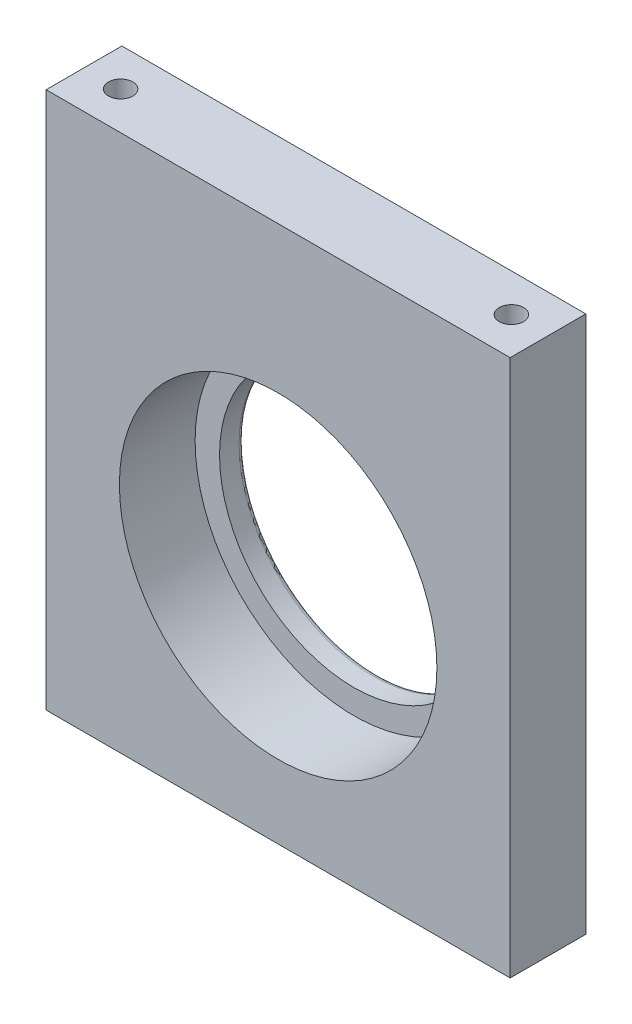
ISO-10303-21;
HEADER;
FILE_DESCRIPTION(('STEP AP214'),'2;1');
FILE_NAME('part.step','',(''),(''),'','','');
FILE_SCHEMA(('AUTOMOTIVE_DESIGN { 1 0 10303 214 1 1 1 1 }'));
ENDSEC;
DATA;
#1=APPLICATION_CONTEXT('core data for automotive mechanical design processes');
#2=APPLICATION_PROTOCOL_DEFINITION('international standard','automotive_design',2000,#1);
#3=PRODUCT_CONTEXT('',#1,'mechanical');
#4=PRODUCT('Part','Part','',(#3));
#5=PRODUCT_RELATED_PRODUCT_CATEGORY('part','',(#4));
#6=PRODUCT_DEFINITION_FORMATION('','',#4);
#7=PRODUCT_DEFINITION_CONTEXT('part definition',#1,'design');
#8=PRODUCT_DEFINITION('design','',#6,#7);
#9=PRODUCT_DEFINITION_SHAPE('','',#8);
#10=(LENGTH_UNIT() NAMED_UNIT(*) SI_UNIT(.MILLI.,.METRE.));
#11=(NAMED_UNIT(*) PLANE_ANGLE_UNIT() SI_UNIT($,.RADIAN.));
#12=(NAMED_UNIT(*) SI_UNIT($,.STERADIAN.) SOLID_ANGLE_UNIT());
#13=UNCERTAINTY_MEASURE_WITH_UNIT(LENGTH_MEASURE(1.E-05),#10,'distance_accuracy_value','');
#14=(GEOMETRIC_REPRESENTATION_CONTEXT(3) GLOBAL_UNCERTAINTY_ASSIGNED_CONTEXT((#13)) GLOBAL_UNIT_ASSIGNED_CONTEXT((#10,
#11,#12)) REPRESENTATION_CONTEXT('',''));
#15=CARTESIAN_POINT('',(0.,0.,0.));
#16=DIRECTION('',(0.,0.,1.));
#17=DIRECTION('',(1.,0.,0.));
#18=AXIS2_PLACEMENT_3D('',#15,#16,#17);
#19=CARTESIAN_POINT('',(0.,0.,-31.));
#20=DIRECTION('',(0.,0.,1.));
#21=DIRECTION('',(1.,0.,0.));
#22=AXIS2_PLACEMENT_3D('',#19,#20,#21);
#23=PLANE('',#22);
#24=DIRECTION('',(1.,0.,0.));
#25=VECTOR('',#24,1.);
#26=CARTESIAN_POINT('',(-75.,172.,-31.));
#27=LINE('',#26,#25);
#28=CARTESIAN_POINT('',(77.,172.,-31.));
#29=VERTEX_POINT('',#28);
#30=CARTESIAN_POINT('',(-77.,172.,-31.));
#31=VERTEX_POINT('',#30);
#32=EDGE_CURVE('E191',#29,#31,#27,.F.);
#33=ORIENTED_EDGE('',*,*,#32,.T.);
#34=DIRECTION('',(0.,1.,0.));
#35=VECTOR('',#34,1.);
#36=CARTESIAN_POINT('',(-77.,20.,-31.));
#37=LINE('',#36,#35);
#38=CARTESIAN_POINT('',(-77.,18.,-31.));
#39=VERTEX_POINT('',#38);
#40=EDGE_CURVE('E197',#31,#39,#37,.F.);
#41=ORIENTED_EDGE('',*,*,#40,.T.);
#42=DIRECTION('',(-1.,0.,0.));
#43=VECTOR('',#42,1.);
#44=CARTESIAN_POINT('',(75.,18.,-31.));
#45=LINE('',#44,#43);
#46=CARTESIAN_POINT('',(77.,18.,-31.));
#47=VERTEX_POINT('',#46);
#48=EDGE_CURVE('E195',#39,#47,#45,.F.);
#49=ORIENTED_EDGE('',*,*,#48,.T.);
#50=DIRECTION('',(0.,-1.,0.));
#51=VECTOR('',#50,1.);
#52=CARTESIAN_POINT('',(77.,170.,-31.));
#53=LINE('',#52,#51);
#54=EDGE_CURVE('E193',#47,#29,#53,.F.);
#55=ORIENTED_EDGE('',*,*,#54,.T.);
#56=EDGE_LOOP('',(#33,#41,#49,#55));
#57=FACE_BOUND('',#56,.T.);
#58=DIRECTION('',(0.,1.,0.));
#59=VECTOR('',#58,1.);
#60=CARTESIAN_POINT('',(95.,0.,-31.));
#61=LINE('',#60,#59);
#62=CARTESIAN_POINT('',(95.,0.,-31.));
#63=VERTEX_POINT('',#62);
#64=CARTESIAN_POINT('',(95.,220.,-31.));
#65=VERTEX_POINT('',#64);
#66=EDGE_CURVE('E159',#63,#65,#61,.T.);
#67=ORIENTED_EDGE('',*,*,#66,.F.);
#68=DIRECTION('',(1.,0.,0.));
#69=VECTOR('',#68,1.);
#70=CARTESIAN_POINT('',(-95.,0.,-31.));
#71=LINE('',#70,#69);
#72=CARTESIAN_POINT('',(-95.,0.,-31.));
#73=VERTEX_POINT('',#72);
#74=EDGE_CURVE('E169',#73,#63,#71,.T.);
#75=ORIENTED_EDGE('',*,*,#74,.F.);
#76=DIRECTION('',(0.,-1.,0.));
#77=VECTOR('',#76,1.);
#78=CARTESIAN_POINT('',(-95.,220.,-31.));
#79=LINE('',#78,#77);
#80=CARTESIAN_POINT('',(-95.,220.,-31.));
#81=VERTEX_POINT('',#80);
#82=EDGE_CURVE('E166',#81,#73,#79,.T.);
#83=ORIENTED_EDGE('',*,*,#82,.F.);
#84=DIRECTION('',(-1.,0.,0.));
#85=VECTOR('',#84,1.);
#86=CARTESIAN_POINT('',(95.,220.,-31.));
#87=LINE('',#86,#85);
#88=EDGE_CURVE('E162',#65,#81,#87,.T.);
#89=ORIENTED_EDGE('',*,*,#88,.F.);
#90=EDGE_LOOP('',(#67,#75,#83,#89));
#91=FACE_BOUND('',#90,.T.);
#92=ADVANCED_FACE('F34',(#57,#91),#23,.F.);
#93=CARTESIAN_POINT('',(95.,0.,-31.));
#94=DIRECTION('',(1.,0.,0.));
#95=DIRECTION('',(0.,1.,0.));
#96=AXIS2_PLACEMENT_3D('',#93,#94,#95);
#97=PLANE('',#96);
#98=DIRECTION('',(0.,1.,0.));
#99=VECTOR('',#98,1.);
#100=CARTESIAN_POINT('',(95.,0.,0.));
#101=LINE('',#100,#99);
#102=CARTESIAN_POINT('',(95.,0.,0.));
#103=VERTEX_POINT('',#102);
#104=CARTESIAN_POINT('',(95.,220.,0.));
#105=VERTEX_POINT('',#104);
#106=EDGE_CURVE('E158',#103,#105,#101,.T.);
#107=ORIENTED_EDGE('',*,*,#106,.F.);
#108=DIRECTION('',(0.,0.,1.));
#109=VECTOR('',#108,1.);
#110=CARTESIAN_POINT('',(95.,0.,-31.));
#111=LINE('',#110,#109);
#112=EDGE_CURVE('E183',#63,#103,#111,.T.);
#113=ORIENTED_EDGE('',*,*,#112,.F.);
#114=ORIENTED_EDGE('',*,*,#66,.T.);
#115=DIRECTION('',(0.,0.,1.));
#116=VECTOR('',#115,1.);
#117=CARTESIAN_POINT('',(95.,220.,-31.));
#118=LINE('',#117,#116);
#119=EDGE_CURVE('E172',#65,#105,#118,.T.);
#120=ORIENTED_EDGE('',*,*,#119,.T.);
#121=EDGE_LOOP('',(#107,#113,#114,#120));
#122=FACE_BOUND('',#121,.T.);
#123=ADVANCED_FACE('F230',(#122),#97,.T.);
#124=CARTESIAN_POINT('',(-95.,0.,-31.));
#125=DIRECTION('',(0.,-1.,0.));
#126=DIRECTION('',(0.,0.,-1.));
#127=AXIS2_PLACEMENT_3D('',#124,#125,#126);
#128=PLANE('',#127);
#129=DIRECTION('',(1.,0.,0.));
#130=VECTOR('',#129,1.);
#131=CARTESIAN_POINT('',(-95.,0.,0.));
#132=LINE('',#131,#130);
#133=CARTESIAN_POINT('',(-95.,0.,0.));
#134=VERTEX_POINT('',#133);
#135=EDGE_CURVE('E163',#134,#103,#132,.T.);
#136=ORIENTED_EDGE('',*,*,#135,.F.);
#137=DIRECTION('',(0.,0.,1.));
#138=VECTOR('',#137,1.);
#139=CARTESIAN_POINT('',(-95.,0.,-31.));
#140=LINE('',#139,#138);
#141=EDGE_CURVE('E185',#73,#134,#140,.T.);
#142=ORIENTED_EDGE('',*,*,#141,.F.);
#143=ORIENTED_EDGE('',*,*,#74,.T.);
#144=ORIENTED_EDGE('',*,*,#112,.T.);
#145=EDGE_LOOP('',(#136,#142,#143,#144));
#146=FACE_BOUND('',#145,.T.);
#147=ADVANCED_FACE('F238',(#146),#128,.T.);
#148=CARTESIAN_POINT('',(-95.,220.,-31.));
#149=DIRECTION('',(-1.,0.,0.));
#150=DIRECTION('',(0.,-1.,0.));
#151=AXIS2_PLACEMENT_3D('',#148,#149,#150);
#152=PLANE('',#151);
#153=DIRECTION('',(0.,-1.,0.));
#154=VECTOR('',#153,1.);
#155=CARTESIAN_POINT('',(-95.,220.,0.));
#156=LINE('',#155,#154);
#157=CARTESIAN_POINT('',(-95.,220.,0.));
#158=VERTEX_POINT('',#157);
#159=EDGE_CURVE('E178',#158,#134,#156,.T.);
#160=ORIENTED_EDGE('',*,*,#159,.F.);
#161=DIRECTION('',(0.,0.,1.));
#162=VECTOR('',#161,1.);
#163=CARTESIAN_POINT('',(-95.,220.,-31.));
#164=LINE('',#163,#162);
#165=EDGE_CURVE('E187',#81,#158,#164,.T.);
#166=ORIENTED_EDGE('',*,*,#165,.F.);
#167=ORIENTED_EDGE('',*,*,#82,.T.);
#168=ORIENTED_EDGE('',*,*,#141,.T.);
#169=EDGE_LOOP('',(#160,#166,#167,#168));
#170=FACE_BOUND('',#169,.T.);
#171=ADVANCED_FACE('F253',(#170),#152,.T.);
#172=CARTESIAN_POINT('',(95.,220.,-31.));
#173=DIRECTION('',(0.,1.,0.));
#174=DIRECTION('',(0.,0.,1.));
#175=AXIS2_PLACEMENT_3D('',#172,#173,#174);
#176=PLANE('',#175);
#177=CARTESIAN_POINT('',(80.,220.,-15.5));
#178=DIRECTION('',(0.,-1.,0.));
#179=DIRECTION('',(0.,0.,1.));
#180=AXIS2_PLACEMENT_3D('',#177,#178,#179);
#181=CIRCLE('',#180,5.);
#182=CARTESIAN_POINT('',(80.,220.,-10.5));
#183=VERTEX_POINT('',#182);
#184=EDGE_CURVE('E135',#183,#183,#181,.T.);
#185=ORIENTED_EDGE('',*,*,#184,.T.);
#186=EDGE_LOOP('',(#185));
#187=FACE_BOUND('',#186,.T.);
#188=CARTESIAN_POINT('',(-80.,220.,-15.5));
#189=DIRECTION('',(0.,1.,0.));
#190=DIRECTION('',(0.,0.,1.));
#191=AXIS2_PLACEMENT_3D('',#188,#189,#190);
#192=CIRCLE('',#191,5.);
#193=CARTESIAN_POINT('',(-80.,220.,-10.5));
#194=VERTEX_POINT('',#193);
#195=EDGE_CURVE('E145',#194,#194,#192,.T.);
#196=ORIENTED_EDGE('',*,*,#195,.F.);
#197=EDGE_LOOP('',(#196));
#198=FACE_BOUND('',#197,.T.);
#199=DIRECTION('',(-1.,0.,0.));
#200=VECTOR('',#199,1.);
#201=CARTESIAN_POINT('',(95.,220.,0.));
#202=LINE('',#201,#200);
#203=EDGE_CURVE('E175',#105,#158,#202,.T.);
#204=ORIENTED_EDGE('',*,*,#203,.F.);
#205=ORIENTED_EDGE('',*,*,#119,.F.);
#206=ORIENTED_EDGE('',*,*,#88,.T.);
#207=ORIENTED_EDGE('',*,*,#165,.T.);
#208=EDGE_LOOP('',(#204,#205,#206,#207));
#209=FACE_BOUND('',#208,.T.);
#210=ADVANCED_FACE('F249',(#187,#198,#209),#176,.T.);
#211=CARTESIAN_POINT('',(0.,0.,0.));
#212=DIRECTION('',(0.,0.,1.));
#213=DIRECTION('',(1.,0.,0.));
#214=AXIS2_PLACEMENT_3D('',#211,#212,#213);
#215=PLANE('',#214);
#216=CARTESIAN_POINT('',(0.,95.,0.));
#217=DIRECTION('',(0.,0.,1.));
#218=DIRECTION('',(1.,0.,0.));
#219=AXIS2_PLACEMENT_3D('',#216,#217,#218);
#220=CIRCLE('',#219,65.);
#221=CARTESIAN_POINT('',(65.,95.,0.));
#222=VERTEX_POINT('',#221);
#223=EDGE_CURVE('E150',#222,#222,#220,.T.);
#224=ORIENTED_EDGE('',*,*,#223,.F.);
#225=EDGE_LOOP('',(#224));
#226=FACE_BOUND('',#225,.T.);
#227=ORIENTED_EDGE('',*,*,#106,.T.);
#228=ORIENTED_EDGE('',*,*,#203,.T.);
#229=ORIENTED_EDGE('',*,*,#159,.T.);
#230=ORIENTED_EDGE('',*,*,#135,.T.);
#231=EDGE_LOOP('',(#227,#228,#229,#230));
#232=FACE_BOUND('',#231,.T.);
#233=ADVANCED_FACE('F246',(#226,#232),#215,.T.);
#234=CARTESIAN_POINT('',(0.,95.,-38.));
#235=DIRECTION('',(0.,0.,1.));
#236=DIRECTION('',(1.,0.,0.));
#237=AXIS2_PLACEMENT_3D('',#234,#235,#236);
#238=CYLINDRICAL_SURFACE('',#237,65.);
#239=ORIENTED_EDGE('',*,*,#223,.T.);
#240=EDGE_LOOP('',(#239));
#241=FACE_BOUND('',#240,.T.);
#242=CARTESIAN_POINT('',(0.,95.,-31.));
#243=DIRECTION('',(0.,0.,1.));
#244=DIRECTION('',(1.,0.,0.));
#245=AXIS2_PLACEMENT_3D('',#242,#243,#244);
#246=CIRCLE('',#245,65.);
#247=CARTESIAN_POINT('',(65.,95.,-31.));
#248=VERTEX_POINT('',#247);
#249=EDGE_CURVE('E155',#248,#248,#246,.T.);
#250=ORIENTED_EDGE('',*,*,#249,.F.);
#251=EDGE_LOOP('',(#250));
#252=FACE_BOUND('',#251,.T.);
#253=ADVANCED_FACE('F244',(#241,#252),#238,.F.);
#254=CARTESIAN_POINT('',(-80.,190.,-15.5));
#255=DIRECTION('',(0.,1.,0.));
#256=DIRECTION('',(0.,0.,1.));
#257=AXIS2_PLACEMENT_3D('',#254,#255,#256);
#258=CYLINDRICAL_SURFACE('',#257,5.);
#259=CARTESIAN_POINT('',(-80.,190.,-15.5));
#260=DIRECTION('',(0.,1.,0.));
#261=DIRECTION('',(0.,0.,1.));
#262=AXIS2_PLACEMENT_3D('',#259,#260,#261);
#263=CIRCLE('',#262,5.);
#264=CARTESIAN_POINT('',(-80.,190.,-10.5));
#265=VERTEX_POINT('',#264);
#266=EDGE_CURVE('E147',#265,#265,#263,.T.);
#267=ORIENTED_EDGE('',*,*,#266,.F.);
#268=EDGE_LOOP('',(#267));
#269=FACE_BOUND('',#268,.T.);
#270=ORIENTED_EDGE('',*,*,#195,.T.);
#271=EDGE_LOOP('',(#270));
#272=FACE_BOUND('',#271,.T.);
#273=ADVANCED_FACE('F302',(#269,#272),#258,.F.);
#274=CARTESIAN_POINT('',(-80.,190.,-15.5));
#275=DIRECTION('',(0.,1.,0.));
#276=DIRECTION('',(0.,0.,1.));
#277=AXIS2_PLACEMENT_3D('',#274,#275,#276);
#278=PLANE('',#277);
#279=ORIENTED_EDGE('',*,*,#266,.T.);
#280=EDGE_LOOP('',(#279));
#281=FACE_BOUND('',#280,.T.);
#282=ADVANCED_FACE('F307',(#281),#278,.T.);
#283=CARTESIAN_POINT('',(80.,190.,-15.5));
#284=DIRECTION('',(0.,1.,0.));
#285=DIRECTION('',(0.,0.,1.));
#286=AXIS2_PLACEMENT_3D('',#283,#284,#285);
#287=CYLINDRICAL_SURFACE('',#286,5.);
#288=CARTESIAN_POINT('',(80.,190.,-15.5));
#289=DIRECTION('',(0.,-1.,0.));
#290=DIRECTION('',(0.,0.,1.));
#291=AXIS2_PLACEMENT_3D('',#288,#289,#290);
#292=CIRCLE('',#291,5.);
#293=CARTESIAN_POINT('',(80.,190.,-10.5));
#294=VERTEX_POINT('',#293);
#295=EDGE_CURVE('E138',#294,#294,#292,.T.);
#296=ORIENTED_EDGE('',*,*,#295,.T.);
#297=EDGE_LOOP('',(#296));
#298=FACE_BOUND('',#297,.T.);
#299=ORIENTED_EDGE('',*,*,#184,.F.);
#300=EDGE_LOOP('',(#299));
#301=FACE_BOUND('',#300,.T.);
#302=ADVANCED_FACE('F323',(#298,#301),#287,.F.);
#303=CARTESIAN_POINT('',(80.,190.,-15.5));
#304=DIRECTION('',(0.,1.,0.));
#305=DIRECTION('',(0.,0.,1.));
#306=AXIS2_PLACEMENT_3D('',#303,#304,#305);
#307=PLANE('',#306);
#308=ORIENTED_EDGE('',*,*,#295,.F.);
#309=EDGE_LOOP('',(#308));
#310=FACE_BOUND('',#309,.T.);
#311=ADVANCED_FACE('F297',(#310),#307,.T.);
#312=CARTESIAN_POINT('',(0.,0.,-31.));
#313=DIRECTION('',(0.,0.,1.));
#314=DIRECTION('',(1.,0.,0.));
#315=AXIS2_PLACEMENT_3D('',#312,#313,#314);
#316=PLANE('',#315);
#317=CARTESIAN_POINT('',(0.,95.,-31.));
#318=DIRECTION('',(0.,0.,-1.));
#319=DIRECTION('',(-1.,0.,0.));
#320=AXIS2_PLACEMENT_3D('',#317,#318,#319);
#321=CIRCLE('',#320,55.);
#322=CARTESIAN_POINT('',(-55.,95.,-31.));
#323=VERTEX_POINT('',#322);
#324=EDGE_CURVE('E129',#323,#323,#321,.T.);
#325=ORIENTED_EDGE('',*,*,#324,.T.);
#326=EDGE_LOOP('',(#325));
#327=FACE_BOUND('',#326,.T.);
#328=ORIENTED_EDGE('',*,*,#249,.T.);
#329=EDGE_LOOP('',(#328));
#330=FACE_BOUND('',#329,.T.);
#331=ADVANCED_FACE('F294',(#327,#330),#316,.T.);
#332=CARTESIAN_POINT('',(0.,0.,-41.));
#333=DIRECTION('',(0.,0.,1.));
#334=DIRECTION('',(1.,0.,0.));
#335=AXIS2_PLACEMENT_3D('',#332,#333,#334);
#336=PLANE('',#335);
#337=CARTESIAN_POINT('',(0.,95.,-41.));
#338=DIRECTION('',(0.,0.,1.));
#339=DIRECTION('',(1.,0.,0.));
#340=AXIS2_PLACEMENT_3D('',#337,#338,#339);
#341=CIRCLE('',#340,57.);
#342=CARTESIAN_POINT('',(57.,95.,-41.));
#343=VERTEX_POINT('',#342);
#344=EDGE_CURVE('E11',#343,#343,#341,.T.);
#345=ORIENTED_EDGE('',*,*,#344,.T.);
#346=EDGE_LOOP('',(#345));
#347=FACE_BOUND('',#346,.T.);
#348=DIRECTION('',(0.,1.,0.));
#349=VECTOR('',#348,1.);
#350=CARTESIAN_POINT('',(-75.,20.,-41.));
#351=LINE('',#350,#349);
#352=CARTESIAN_POINT('',(-75.,20.,-41.));
#353=VERTEX_POINT('',#352);
#354=CARTESIAN_POINT('',(-75.,170.,-41.));
#355=VERTEX_POINT('',#354);
#356=EDGE_CURVE('E120',#353,#355,#351,.T.);
#357=ORIENTED_EDGE('',*,*,#356,.T.);
#358=DIRECTION('',(1.,0.,0.));
#359=VECTOR('',#358,1.);
#360=CARTESIAN_POINT('',(75.,170.,-41.));
#361=LINE('',#360,#359);
#362=CARTESIAN_POINT('',(75.,170.,-41.));
#363=VERTEX_POINT('',#362);
#364=EDGE_CURVE('E111',#355,#363,#361,.T.);
#365=ORIENTED_EDGE('',*,*,#364,.T.);
#366=DIRECTION('',(0.,-1.,0.));
#367=VECTOR('',#366,1.);
#368=CARTESIAN_POINT('',(75.,20.,-41.));
#369=LINE('',#368,#367);
#370=CARTESIAN_POINT('',(75.,20.,-41.));
#371=VERTEX_POINT('',#370);
#372=EDGE_CURVE('E119',#363,#371,#369,.T.);
#373=ORIENTED_EDGE('',*,*,#372,.T.);
#374=DIRECTION('',(-1.,0.,0.));
#375=VECTOR('',#374,1.);
#376=CARTESIAN_POINT('',(75.,20.,-41.));
#377=LINE('',#376,#375);
#378=EDGE_CURVE('E125',#371,#353,#377,.T.);
#379=ORIENTED_EDGE('',*,*,#378,.T.);
#380=EDGE_LOOP('',(#357,#365,#373,#379));
#381=FACE_BOUND('',#380,.T.);
#382=ADVANCED_FACE('F123',(#347,#381),#336,.F.);
#383=CARTESIAN_POINT('',(-75.,20.,-41.));
#384=DIRECTION('',(1.,0.,0.));
#385=DIRECTION('',(0.,0.,-1.));
#386=AXIS2_PLACEMENT_3D('',#383,#384,#385);
#387=PLANE('',#386);
#388=DIRECTION('',(0.,0.,1.));
#389=VECTOR('',#388,1.);
#390=CARTESIAN_POINT('',(-75.,20.,-41.));
#391=LINE('',#390,#389);
#392=CARTESIAN_POINT('',(-75.,20.,-33.));
#393=VERTEX_POINT('',#392);
#394=EDGE_CURVE('E286',#353,#393,#391,.T.);
#395=ORIENTED_EDGE('',*,*,#394,.T.);
#396=DIRECTION('',(0.,1.,0.));
#397=VECTOR('',#396,1.);
#398=CARTESIAN_POINT('',(-75.,170.,-33.));
#399=LINE('',#398,#397);
#400=CARTESIAN_POINT('',(-75.,170.,-33.));
#401=VERTEX_POINT('',#400);
#402=EDGE_CURVE('E134',#393,#401,#399,.T.);
#403=ORIENTED_EDGE('',*,*,#402,.T.);
#404=DIRECTION('',(0.,0.,1.));
#405=VECTOR('',#404,1.);
#406=CARTESIAN_POINT('',(-75.,170.,-41.));
#407=LINE('',#406,#405);
#408=EDGE_CURVE('E115',#355,#401,#407,.T.);
#409=ORIENTED_EDGE('',*,*,#408,.F.);
#410=ORIENTED_EDGE('',*,*,#356,.F.);
#411=EDGE_LOOP('',(#395,#403,#409,#410));
#412=FACE_BOUND('',#411,.T.);
#413=ADVANCED_FACE('F132',(#412),#387,.F.);
#414=CARTESIAN_POINT('',(75.,170.,-41.));
#415=DIRECTION('',(0.,-1.,0.));
#416=DIRECTION('',(0.,0.,-1.));
#417=AXIS2_PLACEMENT_3D('',#414,#415,#416);
#418=PLANE('',#417);
#419=ORIENTED_EDGE('',*,*,#408,.T.);
#420=DIRECTION('',(1.,0.,0.));
#421=VECTOR('',#420,1.);
#422=CARTESIAN_POINT('',(75.,170.,-33.));
#423=LINE('',#422,#421);
#424=CARTESIAN_POINT('',(75.,170.,-33.));
#425=VERTEX_POINT('',#424);
#426=EDGE_CURVE('E49',#401,#425,#423,.T.);
#427=ORIENTED_EDGE('',*,*,#426,.T.);
#428=DIRECTION('',(0.,0.,1.));
#429=VECTOR('',#428,1.);
#430=CARTESIAN_POINT('',(75.,170.,-41.));
#431=LINE('',#430,#429);
#432=EDGE_CURVE('E116',#363,#425,#431,.T.);
#433=ORIENTED_EDGE('',*,*,#432,.F.);
#434=ORIENTED_EDGE('',*,*,#364,.F.);
#435=EDGE_LOOP('',(#419,#427,#433,#434));
#436=FACE_BOUND('',#435,.T.);
#437=ADVANCED_FACE('F113',(#436),#418,.F.);
#438=CARTESIAN_POINT('',(75.,20.,-41.));
#439=DIRECTION('',(-1.,0.,0.));
#440=DIRECTION('',(0.,0.,1.));
#441=AXIS2_PLACEMENT_3D('',#438,#439,#440);
#442=PLANE('',#441);
#443=ORIENTED_EDGE('',*,*,#432,.T.);
#444=DIRECTION('',(0.,-1.,0.));
#445=VECTOR('',#444,1.);
#446=CARTESIAN_POINT('',(75.,20.,-33.));
#447=LINE('',#446,#445);
#448=CARTESIAN_POINT('',(75.,20.,-33.));
#449=VERTEX_POINT('',#448);
#450=EDGE_CURVE('E56',#425,#449,#447,.T.);
#451=ORIENTED_EDGE('',*,*,#450,.T.);
#452=DIRECTION('',(0.,0.,1.));
#453=VECTOR('',#452,1.);
#454=CARTESIAN_POINT('',(75.,20.,-41.));
#455=LINE('',#454,#453);
#456=EDGE_CURVE('E140',#371,#449,#455,.T.);
#457=ORIENTED_EDGE('',*,*,#456,.F.);
#458=ORIENTED_EDGE('',*,*,#372,.F.);
#459=EDGE_LOOP('',(#443,#451,#457,#458));
#460=FACE_BOUND('',#459,.T.);
#461=ADVANCED_FACE('F338',(#460),#442,.F.);
#462=CARTESIAN_POINT('',(75.,20.,-41.));
#463=DIRECTION('',(0.,1.,0.));
#464=DIRECTION('',(0.,0.,1.));
#465=AXIS2_PLACEMENT_3D('',#462,#463,#464);
#466=PLANE('',#465);
#467=ORIENTED_EDGE('',*,*,#456,.T.);
#468=DIRECTION('',(-1.,0.,0.));
#469=VECTOR('',#468,1.);
#470=CARTESIAN_POINT('',(-75.,20.,-33.));
#471=LINE('',#470,#469);
#472=EDGE_CURVE('E200',#449,#393,#471,.T.);
#473=ORIENTED_EDGE('',*,*,#472,.T.);
#474=ORIENTED_EDGE('',*,*,#394,.F.);
#475=ORIENTED_EDGE('',*,*,#378,.F.);
#476=EDGE_LOOP('',(#467,#473,#474,#475));
#477=FACE_BOUND('',#476,.T.);
#478=ADVANCED_FACE('F274',(#477),#466,.F.);
#479=CARTESIAN_POINT('',(0.,95.,-41.));
#480=DIRECTION('',(0.,0.,1.));
#481=DIRECTION('',(1.,0.,0.));
#482=AXIS2_PLACEMENT_3D('',#479,#480,#481);
#483=CYLINDRICAL_SURFACE('',#482,55.);
#484=CARTESIAN_POINT('',(0.,95.,-39.));
#485=DIRECTION('',(0.,0.,1.));
#486=DIRECTION('',(1.,0.,0.));
#487=AXIS2_PLACEMENT_3D('',#484,#485,#486);
#488=CIRCLE('',#487,55.);
#489=CARTESIAN_POINT('',(55.,95.,-39.));
#490=VERTEX_POINT('',#489);
#491=EDGE_CURVE('E42',#490,#490,#488,.F.);
#492=ORIENTED_EDGE('',*,*,#491,.T.);
#493=EDGE_LOOP('',(#492));
#494=FACE_BOUND('',#493,.T.);
#495=ORIENTED_EDGE('',*,*,#324,.F.);
#496=EDGE_LOOP('',(#495));
#497=FACE_BOUND('',#496,.T.);
#498=ADVANCED_FACE('F216',(#494,#497),#483,.F.);
#499=CARTESIAN_POINT('',(77.,20.,-33.));
#500=DIRECTION('',(0.,1.,0.));
#501=DIRECTION('',(0.,0.,1.));
#502=AXIS2_PLACEMENT_3D('',#499,#500,#501);
#503=CYLINDRICAL_SURFACE('',#502,2.);
#504=CARTESIAN_POINT('',(77.,172.,-33.));
#505=DIRECTION('',(-0.707106781186547,0.707106781186547,0.));
#506=DIRECTION('',(-0.707106781186547,-0.707106781186547,0.));
#507=AXIS2_PLACEMENT_3D('',#504,#505,#506);
#508=ELLIPSE('',#507,2.82842712474619,2.);
#509=EDGE_CURVE('E208',#29,#425,#508,.F.);
#510=ORIENTED_EDGE('',*,*,#509,.F.);
#511=ORIENTED_EDGE('',*,*,#54,.F.);
#512=CARTESIAN_POINT('',(77.,18.,-33.));
#513=DIRECTION('',(0.707106781186547,0.707106781186547,0.));
#514=DIRECTION('',(-0.707106781186547,0.707106781186547,0.));
#515=AXIS2_PLACEMENT_3D('',#512,#513,#514);
#516=ELLIPSE('',#515,2.82842712474619,2.);
#517=EDGE_CURVE('E211',#449,#47,#516,.T.);
#518=ORIENTED_EDGE('',*,*,#517,.F.);
#519=ORIENTED_EDGE('',*,*,#450,.F.);
#520=EDGE_LOOP('',(#510,#511,#518,#519));
#521=FACE_BOUND('',#520,.T.);
#522=ADVANCED_FACE('F266',(#521),#503,.F.);
#523=CARTESIAN_POINT('',(75.,18.,-33.));
#524=DIRECTION('',(1.,0.,0.));
#525=DIRECTION('',(0.,0.,-1.));
#526=AXIS2_PLACEMENT_3D('',#523,#524,#525);
#527=CYLINDRICAL_SURFACE('',#526,2.);
#528=ORIENTED_EDGE('',*,*,#517,.T.);
#529=ORIENTED_EDGE('',*,*,#48,.F.);
#530=CARTESIAN_POINT('',(-77.,18.,-33.));
#531=DIRECTION('',(0.707106781186547,-0.707106781186547,0.));
#532=DIRECTION('',(0.707106781186547,0.707106781186547,0.));
#533=AXIS2_PLACEMENT_3D('',#530,#531,#532);
#534=ELLIPSE('',#533,2.82842712474619,2.);
#535=EDGE_CURVE('E206',#393,#39,#534,.T.);
#536=ORIENTED_EDGE('',*,*,#535,.F.);
#537=ORIENTED_EDGE('',*,*,#472,.F.);
#538=EDGE_LOOP('',(#528,#529,#536,#537));
#539=FACE_BOUND('',#538,.T.);
#540=ADVANCED_FACE('F263',(#539),#527,.F.);
#541=CARTESIAN_POINT('',(75.,172.,-33.));
#542=DIRECTION('',(-1.,0.,0.));
#543=DIRECTION('',(0.,0.,1.));
#544=AXIS2_PLACEMENT_3D('',#541,#542,#543);
#545=CYLINDRICAL_SURFACE('',#544,2.);
#546=ORIENTED_EDGE('',*,*,#509,.T.);
#547=ORIENTED_EDGE('',*,*,#426,.F.);
#548=CARTESIAN_POINT('',(-77.,172.,-33.));
#549=DIRECTION('',(-0.707106781186547,-0.707106781186547,0.));
#550=DIRECTION('',(-0.707106781186547,0.707106781186547,0.));
#551=AXIS2_PLACEMENT_3D('',#548,#549,#550);
#552=ELLIPSE('',#551,2.82842712474619,2.);
#553=EDGE_CURVE('E204',#31,#401,#552,.F.);
#554=ORIENTED_EDGE('',*,*,#553,.F.);
#555=ORIENTED_EDGE('',*,*,#32,.F.);
#556=EDGE_LOOP('',(#546,#547,#554,#555));
#557=FACE_BOUND('',#556,.T.);
#558=ADVANCED_FACE('F225',(#557),#545,.F.);
#559=CARTESIAN_POINT('',(-77.,20.,-33.));
#560=DIRECTION('',(0.,-1.,0.));
#561=DIRECTION('',(0.,0.,-1.));
#562=AXIS2_PLACEMENT_3D('',#559,#560,#561);
#563=CYLINDRICAL_SURFACE('',#562,2.);
#564=ORIENTED_EDGE('',*,*,#535,.T.);
#565=ORIENTED_EDGE('',*,*,#40,.F.);
#566=ORIENTED_EDGE('',*,*,#553,.T.);
#567=ORIENTED_EDGE('',*,*,#402,.F.);
#568=EDGE_LOOP('',(#564,#565,#566,#567));
#569=FACE_BOUND('',#568,.T.);
#570=ADVANCED_FACE('F220',(#569),#563,.F.);
#571=CARTESIAN_POINT('',(0.,95.,-39.));
#572=DIRECTION('',(0.,0.,1.));
#573=DIRECTION('',(1.,0.,0.));
#574=AXIS2_PLACEMENT_3D('',#571,#572,#573);
#575=TOROIDAL_SURFACE('',#574,57.,2.);
#576=ORIENTED_EDGE('',*,*,#344,.F.);
#577=EDGE_LOOP('',(#576));
#578=FACE_BOUND('',#577,.T.);
#579=ORIENTED_EDGE('',*,*,#491,.F.);
#580=EDGE_LOOP('',(#579));
#581=FACE_BOUND('',#580,.T.);
#582=ADVANCED_FACE('F36',(#578,#581),#575,.T.);
#583=CLOSED_SHELL('',(#92,#123,#147,#171,#210,#233,#253,#273,#282,#302,#311,#331,#382,#413,#437,
#461,#478,#498,#522,#540,#558,#570,#582));
#584=MANIFOLD_SOLID_BREP('B2',#583);
#585=ADVANCED_BREP_SHAPE_REPRESENTATION('',(#18,#584),#14);
#586=SHAPE_DEFINITION_REPRESENTATION(#9,#585);
ENDSEC;
END-ISO-10303-21;
